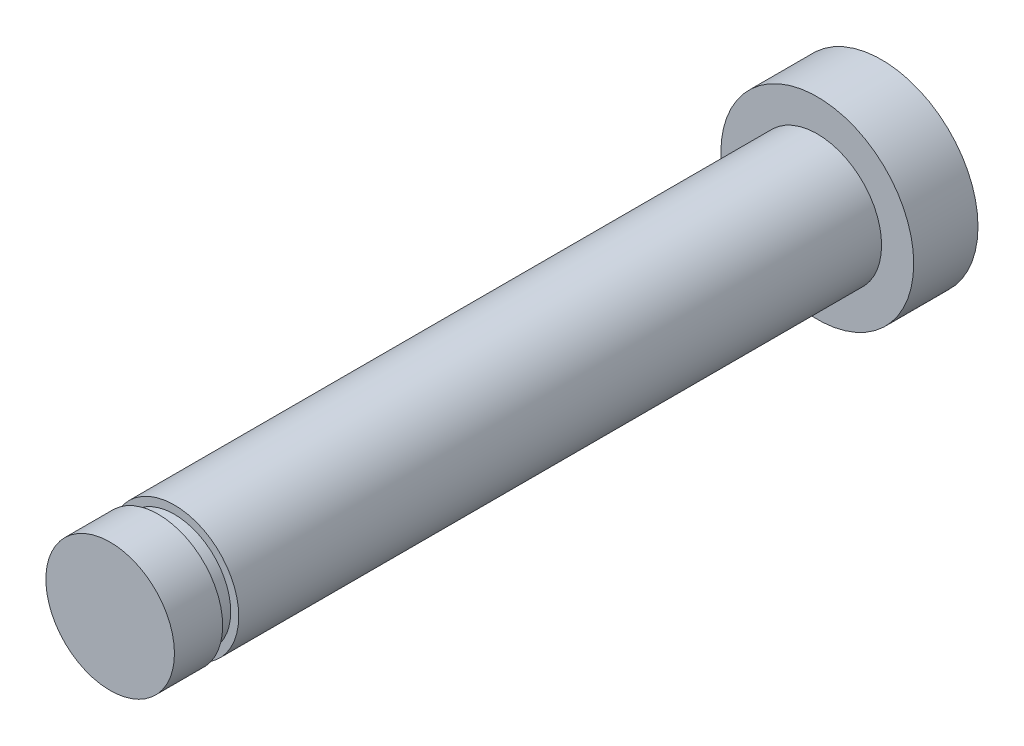
ISO-10303-21;
HEADER;
FILE_DESCRIPTION(('STEP AP214'),'2;1');
FILE_NAME('part.step','',(''),(''),'','','');
FILE_SCHEMA(('AUTOMOTIVE_DESIGN { 1 0 10303 214 1 1 1 1 }'));
ENDSEC;
DATA;
#1=APPLICATION_CONTEXT('core data for automotive mechanical design processes');
#2=APPLICATION_PROTOCOL_DEFINITION('international standard','automotive_design',2000,#1);
#3=PRODUCT_CONTEXT('',#1,'mechanical');
#4=PRODUCT('Part','Part','',(#3));
#5=PRODUCT_RELATED_PRODUCT_CATEGORY('part','',(#4));
#6=PRODUCT_DEFINITION_FORMATION('','',#4);
#7=PRODUCT_DEFINITION_CONTEXT('part definition',#1,'design');
#8=PRODUCT_DEFINITION('design','',#6,#7);
#9=PRODUCT_DEFINITION_SHAPE('','',#8);
#10=(LENGTH_UNIT() NAMED_UNIT(*) SI_UNIT(.MILLI.,.METRE.));
#11=(NAMED_UNIT(*) PLANE_ANGLE_UNIT() SI_UNIT($,.RADIAN.));
#12=(NAMED_UNIT(*) SI_UNIT($,.STERADIAN.) SOLID_ANGLE_UNIT());
#13=UNCERTAINTY_MEASURE_WITH_UNIT(LENGTH_MEASURE(1.E-05),#10,'distance_accuracy_value','');
#14=(GEOMETRIC_REPRESENTATION_CONTEXT(3) GLOBAL_UNCERTAINTY_ASSIGNED_CONTEXT((#13)) GLOBAL_UNIT_ASSIGNED_CONTEXT((#10,
#11,#12)) REPRESENTATION_CONTEXT('',''));
#15=CARTESIAN_POINT('',(0.,0.,0.));
#16=DIRECTION('',(0.,0.,1.));
#17=DIRECTION('',(1.,0.,0.));
#18=AXIS2_PLACEMENT_3D('',#15,#16,#17);
#19=CARTESIAN_POINT('',(0.,0.,4.));
#20=DIRECTION('',(0.,0.,-1.));
#21=DIRECTION('',(-1.,0.,0.));
#22=AXIS2_PLACEMENT_3D('',#19,#20,#21);
#23=CYLINDRICAL_SURFACE('',#22,6.);
#24=CARTESIAN_POINT('',(0.,0.,4.));
#25=DIRECTION('',(0.,0.,1.));
#26=DIRECTION('',(1.,0.,0.));
#27=AXIS2_PLACEMENT_3D('',#24,#25,#26);
#28=CIRCLE('',#27,6.);
#29=CARTESIAN_POINT('',(6.,0.,4.));
#30=VERTEX_POINT('',#29);
#31=EDGE_CURVE('E46',#30,#30,#28,.T.);
#32=ORIENTED_EDGE('',*,*,#31,.F.);
#33=EDGE_LOOP('',(#32));
#34=FACE_BOUND('',#33,.T.);
#35=CARTESIAN_POINT('',(0.,0.,0.));
#36=DIRECTION('',(0.,0.,1.));
#37=DIRECTION('',(1.,0.,0.));
#38=AXIS2_PLACEMENT_3D('',#35,#36,#37);
#39=CIRCLE('',#38,6.);
#40=CARTESIAN_POINT('',(6.,0.,0.));
#41=VERTEX_POINT('',#40);
#42=EDGE_CURVE('E37',#41,#41,#39,.T.);
#43=ORIENTED_EDGE('',*,*,#42,.T.);
#44=EDGE_LOOP('',(#43));
#45=FACE_BOUND('',#44,.T.);
#46=ADVANCED_FACE('F34',(#34,#45),#23,.T.);
#47=CARTESIAN_POINT('',(0.,0.,4.));
#48=DIRECTION('',(0.,0.,1.));
#49=DIRECTION('',(1.,0.,0.));
#50=AXIS2_PLACEMENT_3D('',#47,#48,#49);
#51=PLANE('',#50);
#52=CARTESIAN_POINT('',(0.,0.,4.));
#53=DIRECTION('',(0.,0.,1.));
#54=DIRECTION('',(1.,0.,0.));
#55=AXIS2_PLACEMENT_3D('',#52,#53,#54);
#56=CIRCLE('',#55,4.);
#57=CARTESIAN_POINT('',(4.,0.,4.));
#58=VERTEX_POINT('',#57);
#59=EDGE_CURVE('E41',#58,#58,#56,.T.);
#60=ORIENTED_EDGE('',*,*,#59,.F.);
#61=EDGE_LOOP('',(#60));
#62=FACE_BOUND('',#61,.T.);
#63=ORIENTED_EDGE('',*,*,#31,.T.);
#64=EDGE_LOOP('',(#63));
#65=FACE_BOUND('',#64,.T.);
#66=ADVANCED_FACE('F64',(#62,#65),#51,.T.);
#67=CARTESIAN_POINT('',(0.,0.,0.));
#68=DIRECTION('',(0.,0.,1.));
#69=DIRECTION('',(1.,0.,0.));
#70=AXIS2_PLACEMENT_3D('',#67,#68,#69);
#71=PLANE('',#70);
#72=ORIENTED_EDGE('',*,*,#42,.F.);
#73=EDGE_LOOP('',(#72));
#74=FACE_BOUND('',#73,.T.);
#75=ADVANCED_FACE('F61',(#74),#71,.F.);
#76=CARTESIAN_POINT('',(0.,0.,44.));
#77=DIRECTION('',(0.,0.,-1.));
#78=DIRECTION('',(-1.,0.,0.));
#79=AXIS2_PLACEMENT_3D('',#76,#77,#78);
#80=CYLINDRICAL_SURFACE('',#79,4.);
#81=CARTESIAN_POINT('',(0.,0.,44.));
#82=DIRECTION('',(0.,0.,1.));
#83=DIRECTION('',(1.,0.,0.));
#84=AXIS2_PLACEMENT_3D('',#81,#82,#83);
#85=CIRCLE('',#84,4.);
#86=CARTESIAN_POINT('',(4.,0.,44.));
#87=VERTEX_POINT('',#86);
#88=EDGE_CURVE('E52',#87,#87,#85,.T.);
#89=ORIENTED_EDGE('',*,*,#88,.F.);
#90=EDGE_LOOP('',(#89));
#91=FACE_BOUND('',#90,.T.);
#92=ORIENTED_EDGE('',*,*,#59,.T.);
#93=EDGE_LOOP('',(#92));
#94=FACE_BOUND('',#93,.T.);
#95=ADVANCED_FACE('F63',(#91,#94),#80,.T.);
#96=CARTESIAN_POINT('',(0.,0.,44.));
#97=DIRECTION('',(0.,0.,1.));
#98=DIRECTION('',(1.,0.,0.));
#99=AXIS2_PLACEMENT_3D('',#96,#97,#98);
#100=PLANE('',#99);
#101=CARTESIAN_POINT('',(0.,0.,44.));
#102=DIRECTION('',(0.,0.,1.));
#103=DIRECTION('',(1.,0.,0.));
#104=AXIS2_PLACEMENT_3D('',#101,#102,#103);
#105=CIRCLE('',#104,3.5);
#106=CARTESIAN_POINT('',(3.5,0.,44.));
#107=VERTEX_POINT('',#106);
#108=EDGE_CURVE('E10',#107,#107,#105,.T.);
#109=ORIENTED_EDGE('',*,*,#108,.F.);
#110=EDGE_LOOP('',(#109));
#111=FACE_BOUND('',#110,.T.);
#112=ORIENTED_EDGE('',*,*,#88,.T.);
#113=EDGE_LOOP('',(#112));
#114=FACE_BOUND('',#113,.T.);
#115=ADVANCED_FACE('F69',(#111,#114),#100,.T.);
#116=CARTESIAN_POINT('',(0.,0.,45.));
#117=DIRECTION('',(0.,0.,-1.));
#118=DIRECTION('',(-1.,0.,0.));
#119=AXIS2_PLACEMENT_3D('',#116,#117,#118);
#120=CYLINDRICAL_SURFACE('',#119,3.5);
#121=CARTESIAN_POINT('',(0.,0.,45.));
#122=DIRECTION('',(0.,0.,1.));
#123=DIRECTION('',(1.,0.,0.));
#124=AXIS2_PLACEMENT_3D('',#121,#122,#123);
#125=CIRCLE('',#124,3.5);
#126=CARTESIAN_POINT('',(3.5,0.,45.));
#127=VERTEX_POINT('',#126);
#128=EDGE_CURVE('E50',#127,#127,#125,.T.);
#129=ORIENTED_EDGE('',*,*,#128,.F.);
#130=EDGE_LOOP('',(#129));
#131=FACE_BOUND('',#130,.T.);
#132=ORIENTED_EDGE('',*,*,#108,.T.);
#133=EDGE_LOOP('',(#132));
#134=FACE_BOUND('',#133,.T.);
#135=ADVANCED_FACE('F99',(#131,#134),#120,.T.);
#136=CARTESIAN_POINT('',(0.,0.,48.));
#137=DIRECTION('',(0.,0.,-1.));
#138=DIRECTION('',(-1.,0.,0.));
#139=AXIS2_PLACEMENT_3D('',#136,#137,#138);
#140=CYLINDRICAL_SURFACE('',#139,4.);
#141=CARTESIAN_POINT('',(0.,0.,48.));
#142=DIRECTION('',(0.,0.,1.));
#143=DIRECTION('',(1.,0.,0.));
#144=AXIS2_PLACEMENT_3D('',#141,#142,#143);
#145=CIRCLE('',#144,4.);
#146=CARTESIAN_POINT('',(4.,0.,48.));
#147=VERTEX_POINT('',#146);
#148=EDGE_CURVE('E150',#147,#147,#145,.T.);
#149=ORIENTED_EDGE('',*,*,#148,.F.);
#150=EDGE_LOOP('',(#149));
#151=FACE_BOUND('',#150,.T.);
#152=CARTESIAN_POINT('',(0.,0.,45.));
#153=DIRECTION('',(0.,0.,1.));
#154=DIRECTION('',(1.,0.,0.));
#155=AXIS2_PLACEMENT_3D('',#152,#153,#154);
#156=CIRCLE('',#155,4.);
#157=CARTESIAN_POINT('',(4.,0.,45.));
#158=VERTEX_POINT('',#157);
#159=EDGE_CURVE('E148',#158,#158,#156,.T.);
#160=ORIENTED_EDGE('',*,*,#159,.T.);
#161=EDGE_LOOP('',(#160));
#162=FACE_BOUND('',#161,.T.);
#163=ADVANCED_FACE('F109',(#151,#162),#140,.T.);
#164=CARTESIAN_POINT('',(0.,0.,48.));
#165=DIRECTION('',(0.,0.,1.));
#166=DIRECTION('',(1.,0.,0.));
#167=AXIS2_PLACEMENT_3D('',#164,#165,#166);
#168=PLANE('',#167);
#169=ORIENTED_EDGE('',*,*,#148,.T.);
#170=EDGE_LOOP('',(#169));
#171=FACE_BOUND('',#170,.T.);
#172=ADVANCED_FACE('F119',(#171),#168,.T.);
#173=CARTESIAN_POINT('',(0.,0.,45.));
#174=DIRECTION('',(0.,0.,1.));
#175=DIRECTION('',(1.,0.,0.));
#176=AXIS2_PLACEMENT_3D('',#173,#174,#175);
#177=PLANE('',#176);
#178=ORIENTED_EDGE('',*,*,#128,.T.);
#179=EDGE_LOOP('',(#178));
#180=FACE_BOUND('',#179,.T.);
#181=ORIENTED_EDGE('',*,*,#159,.F.);
#182=EDGE_LOOP('',(#181));
#183=FACE_BOUND('',#182,.T.);
#184=ADVANCED_FACE('F129',(#180,#183),#177,.F.);
#185=CLOSED_SHELL('',(#46,#66,#75,#95,#115,#135,#163,#172,#184));
#186=MANIFOLD_SOLID_BREP('B2',#185);
#187=ADVANCED_BREP_SHAPE_REPRESENTATION('',(#18,#186),#14);
#188=SHAPE_DEFINITION_REPRESENTATION(#9,#187);
ENDSEC;
END-ISO-10303-21;
